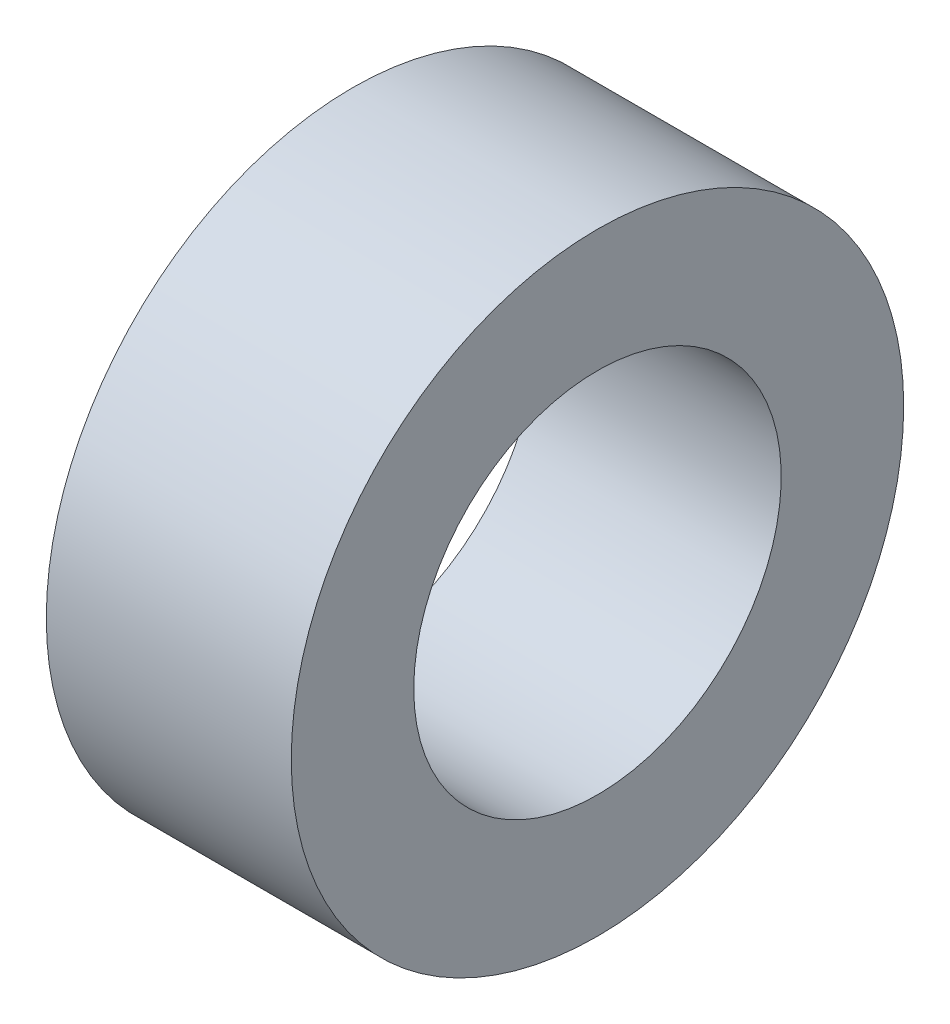
ISO-10303-21;
HEADER;
FILE_DESCRIPTION(('STEP AP214'),'2;1');
FILE_NAME('part.step','',(''),(''),'','','');
FILE_SCHEMA(('AUTOMOTIVE_DESIGN { 1 0 10303 214 1 1 1 1 }'));
ENDSEC;
DATA;
#1=APPLICATION_CONTEXT('core data for automotive mechanical design processes');
#2=APPLICATION_PROTOCOL_DEFINITION('international standard','automotive_design',2000,#1);
#3=PRODUCT_CONTEXT('',#1,'mechanical');
#4=PRODUCT('Part','Part','',(#3));
#5=PRODUCT_RELATED_PRODUCT_CATEGORY('part','',(#4));
#6=PRODUCT_DEFINITION_FORMATION('','',#4);
#7=PRODUCT_DEFINITION_CONTEXT('part definition',#1,'design');
#8=PRODUCT_DEFINITION('design','',#6,#7);
#9=PRODUCT_DEFINITION_SHAPE('','',#8);
#10=(LENGTH_UNIT() NAMED_UNIT(*) SI_UNIT(.MILLI.,.METRE.));
#11=(NAMED_UNIT(*) PLANE_ANGLE_UNIT() SI_UNIT($,.RADIAN.));
#12=(NAMED_UNIT(*) SI_UNIT($,.STERADIAN.) SOLID_ANGLE_UNIT());
#13=UNCERTAINTY_MEASURE_WITH_UNIT(LENGTH_MEASURE(1.E-05),#10,'distance_accuracy_value','');
#14=(GEOMETRIC_REPRESENTATION_CONTEXT(3) GLOBAL_UNCERTAINTY_ASSIGNED_CONTEXT((#13)) GLOBAL_UNIT_ASSIGNED_CONTEXT((#10,
#11,#12)) REPRESENTATION_CONTEXT('',''));
#15=CARTESIAN_POINT('',(0.,0.,0.));
#16=DIRECTION('',(0.,0.,1.));
#17=DIRECTION('',(1.,0.,0.));
#18=AXIS2_PLACEMENT_3D('',#15,#16,#17);
#19=CARTESIAN_POINT('',(-1.,1.5,0.));
#20=DIRECTION('',(1.,0.,0.));
#21=DIRECTION('',(0.,0.,-1.));
#22=AXIS2_PLACEMENT_3D('',#19,#20,#21);
#23=PLANE('',#22);
#24=CARTESIAN_POINT('',(-1.,0.,0.));
#25=DIRECTION('',(-1.,0.,0.));
#26=DIRECTION('',(0.,0.,1.));
#27=AXIS2_PLACEMENT_3D('',#24,#25,#26);
#28=CIRCLE('',#27,1.5);
#29=CARTESIAN_POINT('',(-1.,0.,1.5));
#30=VERTEX_POINT('',#29);
#31=EDGE_CURVE('E10',#30,#30,#28,.T.);
#32=ORIENTED_EDGE('',*,*,#31,.F.);
#33=EDGE_LOOP('',(#32));
#34=FACE_BOUND('',#33,.T.);
#35=CARTESIAN_POINT('',(-1.,0.,0.));
#36=DIRECTION('',(-1.,0.,0.));
#37=DIRECTION('',(0.,0.,1.));
#38=AXIS2_PLACEMENT_3D('',#35,#36,#37);
#39=CIRCLE('',#38,2.5);
#40=CARTESIAN_POINT('',(-1.,0.,2.5));
#41=VERTEX_POINT('',#40);
#42=EDGE_CURVE('E49',#41,#41,#39,.T.);
#43=ORIENTED_EDGE('',*,*,#42,.T.);
#44=EDGE_LOOP('',(#43));
#45=FACE_BOUND('',#44,.T.);
#46=ADVANCED_FACE('F35',(#34,#45),#23,.F.);
#47=CARTESIAN_POINT('',(0.,0.,0.));
#48=DIRECTION('',(-1.,0.,0.));
#49=DIRECTION('',(0.,0.,1.));
#50=AXIS2_PLACEMENT_3D('',#47,#48,#49);
#51=CYLINDRICAL_SURFACE('',#50,1.5);
#52=CARTESIAN_POINT('',(1.,0.,0.));
#53=DIRECTION('',(-1.,0.,0.));
#54=DIRECTION('',(0.,0.,1.));
#55=AXIS2_PLACEMENT_3D('',#52,#53,#54);
#56=CIRCLE('',#55,1.5);
#57=CARTESIAN_POINT('',(1.,0.,1.5));
#58=VERTEX_POINT('',#57);
#59=EDGE_CURVE('E41',#58,#58,#56,.T.);
#60=ORIENTED_EDGE('',*,*,#59,.F.);
#61=EDGE_LOOP('',(#60));
#62=FACE_BOUND('',#61,.T.);
#63=ORIENTED_EDGE('',*,*,#31,.T.);
#64=EDGE_LOOP('',(#63));
#65=FACE_BOUND('',#64,.T.);
#66=ADVANCED_FACE('F64',(#62,#65),#51,.F.);
#67=CARTESIAN_POINT('',(1.,1.5,0.));
#68=DIRECTION('',(-1.,0.,0.));
#69=DIRECTION('',(0.,0.,1.));
#70=AXIS2_PLACEMENT_3D('',#67,#68,#69);
#71=PLANE('',#70);
#72=CARTESIAN_POINT('',(1.,0.,0.));
#73=DIRECTION('',(-1.,0.,0.));
#74=DIRECTION('',(0.,0.,1.));
#75=AXIS2_PLACEMENT_3D('',#72,#73,#74);
#76=CIRCLE('',#75,2.5);
#77=CARTESIAN_POINT('',(1.,0.,2.5));
#78=VERTEX_POINT('',#77);
#79=EDGE_CURVE('E45',#78,#78,#76,.T.);
#80=ORIENTED_EDGE('',*,*,#79,.F.);
#81=EDGE_LOOP('',(#80));
#82=FACE_BOUND('',#81,.T.);
#83=ORIENTED_EDGE('',*,*,#59,.T.);
#84=EDGE_LOOP('',(#83));
#85=FACE_BOUND('',#84,.T.);
#86=ADVANCED_FACE('F59',(#82,#85),#71,.F.);
#87=CARTESIAN_POINT('',(0.,0.,0.));
#88=DIRECTION('',(-1.,0.,0.));
#89=DIRECTION('',(0.,0.,1.));
#90=AXIS2_PLACEMENT_3D('',#87,#88,#89);
#91=CYLINDRICAL_SURFACE('',#90,2.5);
#92=ORIENTED_EDGE('',*,*,#42,.F.);
#93=EDGE_LOOP('',(#92));
#94=FACE_BOUND('',#93,.T.);
#95=ORIENTED_EDGE('',*,*,#79,.T.);
#96=EDGE_LOOP('',(#95));
#97=FACE_BOUND('',#96,.T.);
#98=ADVANCED_FACE('F56',(#94,#97),#91,.T.);
#99=CLOSED_SHELL('',(#46,#66,#86,#98));
#100=MANIFOLD_SOLID_BREP('B2',#99);
#101=ADVANCED_BREP_SHAPE_REPRESENTATION('',(#18,#100),#14);
#102=SHAPE_DEFINITION_REPRESENTATION(#9,#101);
ENDSEC;
END-ISO-10303-21;
